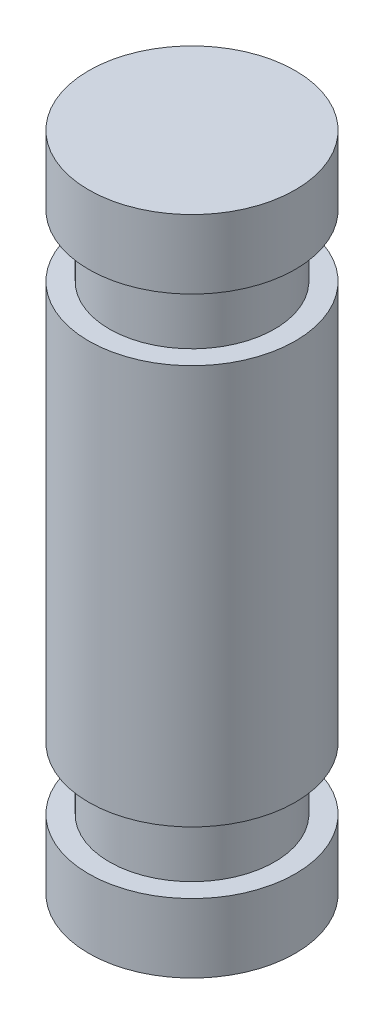
ISO-10303-21;
HEADER;
FILE_DESCRIPTION(('STEP AP214'),'2;1');
FILE_NAME('part.step','',(''),(''),'','','');
FILE_SCHEMA(('AUTOMOTIVE_DESIGN { 1 0 10303 214 1 1 1 1 }'));
ENDSEC;
DATA;
#1=APPLICATION_CONTEXT('core data for automotive mechanical design processes');
#2=APPLICATION_PROTOCOL_DEFINITION('international standard','automotive_design',2000,#1);
#3=PRODUCT_CONTEXT('',#1,'mechanical');
#4=PRODUCT('Part','Part','',(#3));
#5=PRODUCT_RELATED_PRODUCT_CATEGORY('part','',(#4));
#6=PRODUCT_DEFINITION_FORMATION('','',#4);
#7=PRODUCT_DEFINITION_CONTEXT('part definition',#1,'design');
#8=PRODUCT_DEFINITION('design','',#6,#7);
#9=PRODUCT_DEFINITION_SHAPE('','',#8);
#10=(LENGTH_UNIT() NAMED_UNIT(*) SI_UNIT(.MILLI.,.METRE.));
#11=(NAMED_UNIT(*) PLANE_ANGLE_UNIT() SI_UNIT($,.RADIAN.));
#12=(NAMED_UNIT(*) SI_UNIT($,.STERADIAN.) SOLID_ANGLE_UNIT());
#13=UNCERTAINTY_MEASURE_WITH_UNIT(LENGTH_MEASURE(1.E-05),#10,'distance_accuracy_value','');
#14=(GEOMETRIC_REPRESENTATION_CONTEXT(3) GLOBAL_UNCERTAINTY_ASSIGNED_CONTEXT((#13)) GLOBAL_UNIT_ASSIGNED_CONTEXT((#10,
#11,#12)) REPRESENTATION_CONTEXT('',''));
#15=CARTESIAN_POINT('',(0.,0.,0.));
#16=DIRECTION('',(0.,0.,1.));
#17=DIRECTION('',(1.,0.,0.));
#18=AXIS2_PLACEMENT_3D('',#15,#16,#17);
#19=CARTESIAN_POINT('',(0.,-4.8,1.5));
#20=DIRECTION('',(0.,1.,0.));
#21=DIRECTION('',(0.,0.,1.));
#22=AXIS2_PLACEMENT_3D('',#19,#20,#21);
#23=PLANE('',#22);
#24=CARTESIAN_POINT('',(0.,-4.8,0.));
#25=DIRECTION('',(0.,-1.,0.));
#26=DIRECTION('',(0.,0.,-1.));
#27=AXIS2_PLACEMENT_3D('',#24,#25,#26);
#28=CIRCLE('',#27,1.5);
#29=CARTESIAN_POINT('',(0.,-4.8,-1.5));
#30=VERTEX_POINT('',#29);
#31=EDGE_CURVE('E71',#30,#30,#28,.T.);
#32=ORIENTED_EDGE('',*,*,#31,.T.);
#33=EDGE_LOOP('',(#32));
#34=FACE_BOUND('',#33,.T.);
#35=ADVANCED_FACE('F37',(#34),#23,.F.);
#36=CARTESIAN_POINT('',(0.,4.8,0.));
#37=DIRECTION('',(0.,-1.,0.));
#38=DIRECTION('',(0.,0.,-1.));
#39=AXIS2_PLACEMENT_3D('',#36,#37,#38);
#40=PLANE('',#39);
#41=CARTESIAN_POINT('',(0.,4.8,0.));
#42=DIRECTION('',(0.,-1.,0.));
#43=DIRECTION('',(0.,0.,-1.));
#44=AXIS2_PLACEMENT_3D('',#41,#42,#43);
#45=CIRCLE('',#44,1.5);
#46=CARTESIAN_POINT('',(0.,4.8,-1.5));
#47=VERTEX_POINT('',#46);
#48=EDGE_CURVE('E10',#47,#47,#45,.T.);
#49=ORIENTED_EDGE('',*,*,#48,.F.);
#50=EDGE_LOOP('',(#49));
#51=FACE_BOUND('',#50,.T.);
#52=ADVANCED_FACE('F125',(#51),#40,.F.);
#53=CARTESIAN_POINT('',(0.,4.8,0.));
#54=DIRECTION('',(0.,-1.,0.));
#55=DIRECTION('',(0.,0.,-1.));
#56=AXIS2_PLACEMENT_3D('',#53,#54,#55);
#57=CYLINDRICAL_SURFACE('',#56,1.5);
#58=CARTESIAN_POINT('',(0.,3.8,0.));
#59=DIRECTION('',(0.,-1.,0.));
#60=DIRECTION('',(0.,0.,-1.));
#61=AXIS2_PLACEMENT_3D('',#58,#59,#60);
#62=CIRCLE('',#61,1.5);
#63=CARTESIAN_POINT('',(0.,3.8,-1.5));
#64=VERTEX_POINT('',#63);
#65=EDGE_CURVE('E43',#64,#64,#62,.T.);
#66=ORIENTED_EDGE('',*,*,#65,.F.);
#67=EDGE_LOOP('',(#66));
#68=FACE_BOUND('',#67,.T.);
#69=ORIENTED_EDGE('',*,*,#48,.T.);
#70=EDGE_LOOP('',(#69));
#71=FACE_BOUND('',#70,.T.);
#72=ADVANCED_FACE('F120',(#68,#71),#57,.T.);
#73=CARTESIAN_POINT('',(0.,3.8,1.2));
#74=DIRECTION('',(0.,1.,0.));
#75=DIRECTION('',(0.,0.,1.));
#76=AXIS2_PLACEMENT_3D('',#73,#74,#75);
#77=PLANE('',#76);
#78=CARTESIAN_POINT('',(0.,3.8,0.));
#79=DIRECTION('',(0.,-1.,0.));
#80=DIRECTION('',(0.,0.,-1.));
#81=AXIS2_PLACEMENT_3D('',#78,#79,#80);
#82=CIRCLE('',#81,1.2);
#83=CARTESIAN_POINT('',(0.,3.8,-1.2));
#84=VERTEX_POINT('',#83);
#85=EDGE_CURVE('E47',#84,#84,#82,.T.);
#86=ORIENTED_EDGE('',*,*,#85,.F.);
#87=EDGE_LOOP('',(#86));
#88=FACE_BOUND('',#87,.T.);
#89=ORIENTED_EDGE('',*,*,#65,.T.);
#90=EDGE_LOOP('',(#89));
#91=FACE_BOUND('',#90,.T.);
#92=ADVANCED_FACE('F115',(#88,#91),#77,.F.);
#93=CARTESIAN_POINT('',(0.,4.8,0.));
#94=DIRECTION('',(0.,-1.,0.));
#95=DIRECTION('',(0.,0.,-1.));
#96=AXIS2_PLACEMENT_3D('',#93,#94,#95);
#97=CYLINDRICAL_SURFACE('',#96,1.2);
#98=CARTESIAN_POINT('',(0.,2.9,0.));
#99=DIRECTION('',(0.,-1.,0.));
#100=DIRECTION('',(0.,0.,-1.));
#101=AXIS2_PLACEMENT_3D('',#98,#99,#100);
#102=CIRCLE('',#101,1.2);
#103=CARTESIAN_POINT('',(0.,2.9,-1.2));
#104=VERTEX_POINT('',#103);
#105=EDGE_CURVE('E51',#104,#104,#102,.T.);
#106=ORIENTED_EDGE('',*,*,#105,.F.);
#107=EDGE_LOOP('',(#106));
#108=FACE_BOUND('',#107,.T.);
#109=ORIENTED_EDGE('',*,*,#85,.T.);
#110=EDGE_LOOP('',(#109));
#111=FACE_BOUND('',#110,.T.);
#112=ADVANCED_FACE('F109',(#108,#111),#97,.T.);
#113=CARTESIAN_POINT('',(0.,2.9,1.5));
#114=DIRECTION('',(0.,-1.,0.));
#115=DIRECTION('',(0.,0.,-1.));
#116=AXIS2_PLACEMENT_3D('',#113,#114,#115);
#117=PLANE('',#116);
#118=CARTESIAN_POINT('',(0.,2.9,0.));
#119=DIRECTION('',(0.,-1.,0.));
#120=DIRECTION('',(0.,0.,-1.));
#121=AXIS2_PLACEMENT_3D('',#118,#119,#120);
#122=CIRCLE('',#121,1.5);
#123=CARTESIAN_POINT('',(0.,2.9,-1.5));
#124=VERTEX_POINT('',#123);
#125=EDGE_CURVE('E56',#124,#124,#122,.T.);
#126=ORIENTED_EDGE('',*,*,#125,.F.);
#127=EDGE_LOOP('',(#126));
#128=FACE_BOUND('',#127,.T.);
#129=ORIENTED_EDGE('',*,*,#105,.T.);
#130=EDGE_LOOP('',(#129));
#131=FACE_BOUND('',#130,.T.);
#132=ADVANCED_FACE('F103',(#128,#131),#117,.F.);
#133=CARTESIAN_POINT('',(0.,4.8,0.));
#134=DIRECTION('',(0.,-1.,0.));
#135=DIRECTION('',(0.,0.,-1.));
#136=AXIS2_PLACEMENT_3D('',#133,#134,#135);
#137=CYLINDRICAL_SURFACE('',#136,1.5);
#138=CARTESIAN_POINT('',(0.,-2.9,0.));
#139=DIRECTION('',(0.,-1.,0.));
#140=DIRECTION('',(0.,0.,-1.));
#141=AXIS2_PLACEMENT_3D('',#138,#139,#140);
#142=CIRCLE('',#141,1.5);
#143=CARTESIAN_POINT('',(0.,-2.9,-1.5));
#144=VERTEX_POINT('',#143);
#145=EDGE_CURVE('E59',#144,#144,#142,.T.);
#146=ORIENTED_EDGE('',*,*,#145,.F.);
#147=EDGE_LOOP('',(#146));
#148=FACE_BOUND('',#147,.T.);
#149=ORIENTED_EDGE('',*,*,#125,.T.);
#150=EDGE_LOOP('',(#149));
#151=FACE_BOUND('',#150,.T.);
#152=ADVANCED_FACE('F97',(#148,#151),#137,.T.);
#153=CARTESIAN_POINT('',(0.,-2.9,1.5));
#154=DIRECTION('',(0.,1.,0.));
#155=DIRECTION('',(0.,0.,1.));
#156=AXIS2_PLACEMENT_3D('',#153,#154,#155);
#157=PLANE('',#156);
#158=CARTESIAN_POINT('',(0.,-2.9,0.));
#159=DIRECTION('',(0.,-1.,0.));
#160=DIRECTION('',(0.,0.,-1.));
#161=AXIS2_PLACEMENT_3D('',#158,#159,#160);
#162=CIRCLE('',#161,1.2);
#163=CARTESIAN_POINT('',(0.,-2.9,-1.2));
#164=VERTEX_POINT('',#163);
#165=EDGE_CURVE('E62',#164,#164,#162,.T.);
#166=ORIENTED_EDGE('',*,*,#165,.F.);
#167=EDGE_LOOP('',(#166));
#168=FACE_BOUND('',#167,.T.);
#169=ORIENTED_EDGE('',*,*,#145,.T.);
#170=EDGE_LOOP('',(#169));
#171=FACE_BOUND('',#170,.T.);
#172=ADVANCED_FACE('F91',(#168,#171),#157,.F.);
#173=CARTESIAN_POINT('',(0.,4.8,0.));
#174=DIRECTION('',(0.,-1.,0.));
#175=DIRECTION('',(0.,0.,-1.));
#176=AXIS2_PLACEMENT_3D('',#173,#174,#175);
#177=CYLINDRICAL_SURFACE('',#176,1.2);
#178=CARTESIAN_POINT('',(0.,-3.8,0.));
#179=DIRECTION('',(0.,-1.,0.));
#180=DIRECTION('',(0.,0.,-1.));
#181=AXIS2_PLACEMENT_3D('',#178,#179,#180);
#182=CIRCLE('',#181,1.2);
#183=CARTESIAN_POINT('',(0.,-3.8,-1.2));
#184=VERTEX_POINT('',#183);
#185=EDGE_CURVE('E65',#184,#184,#182,.T.);
#186=ORIENTED_EDGE('',*,*,#185,.F.);
#187=EDGE_LOOP('',(#186));
#188=FACE_BOUND('',#187,.T.);
#189=ORIENTED_EDGE('',*,*,#165,.T.);
#190=EDGE_LOOP('',(#189));
#191=FACE_BOUND('',#190,.T.);
#192=ADVANCED_FACE('F85',(#188,#191),#177,.T.);
#193=CARTESIAN_POINT('',(0.,-3.8,1.2));
#194=DIRECTION('',(0.,-1.,0.));
#195=DIRECTION('',(0.,0.,-1.));
#196=AXIS2_PLACEMENT_3D('',#193,#194,#195);
#197=PLANE('',#196);
#198=CARTESIAN_POINT('',(0.,-3.8,0.));
#199=DIRECTION('',(0.,-1.,0.));
#200=DIRECTION('',(0.,0.,-1.));
#201=AXIS2_PLACEMENT_3D('',#198,#199,#200);
#202=CIRCLE('',#201,1.5);
#203=CARTESIAN_POINT('',(0.,-3.8,-1.5));
#204=VERTEX_POINT('',#203);
#205=EDGE_CURVE('E68',#204,#204,#202,.T.);
#206=ORIENTED_EDGE('',*,*,#205,.F.);
#207=EDGE_LOOP('',(#206));
#208=FACE_BOUND('',#207,.T.);
#209=ORIENTED_EDGE('',*,*,#185,.T.);
#210=EDGE_LOOP('',(#209));
#211=FACE_BOUND('',#210,.T.);
#212=ADVANCED_FACE('F79',(#208,#211),#197,.F.);
#213=CARTESIAN_POINT('',(0.,4.8,0.));
#214=DIRECTION('',(0.,-1.,0.));
#215=DIRECTION('',(0.,0.,-1.));
#216=AXIS2_PLACEMENT_3D('',#213,#214,#215);
#217=CYLINDRICAL_SURFACE('',#216,1.5);
#218=ORIENTED_EDGE('',*,*,#31,.F.);
#219=EDGE_LOOP('',(#218));
#220=FACE_BOUND('',#219,.T.);
#221=ORIENTED_EDGE('',*,*,#205,.T.);
#222=EDGE_LOOP('',(#221));
#223=FACE_BOUND('',#222,.T.);
#224=ADVANCED_FACE('F76',(#220,#223),#217,.T.);
#225=CLOSED_SHELL('',(#35,#52,#72,#92,#112,#132,#152,#172,#192,#212,#224));
#226=MANIFOLD_SOLID_BREP('B2',#225);
#227=ADVANCED_BREP_SHAPE_REPRESENTATION('',(#18,#226),#14);
#228=SHAPE_DEFINITION_REPRESENTATION(#9,#227);
ENDSEC;
END-ISO-10303-21;
